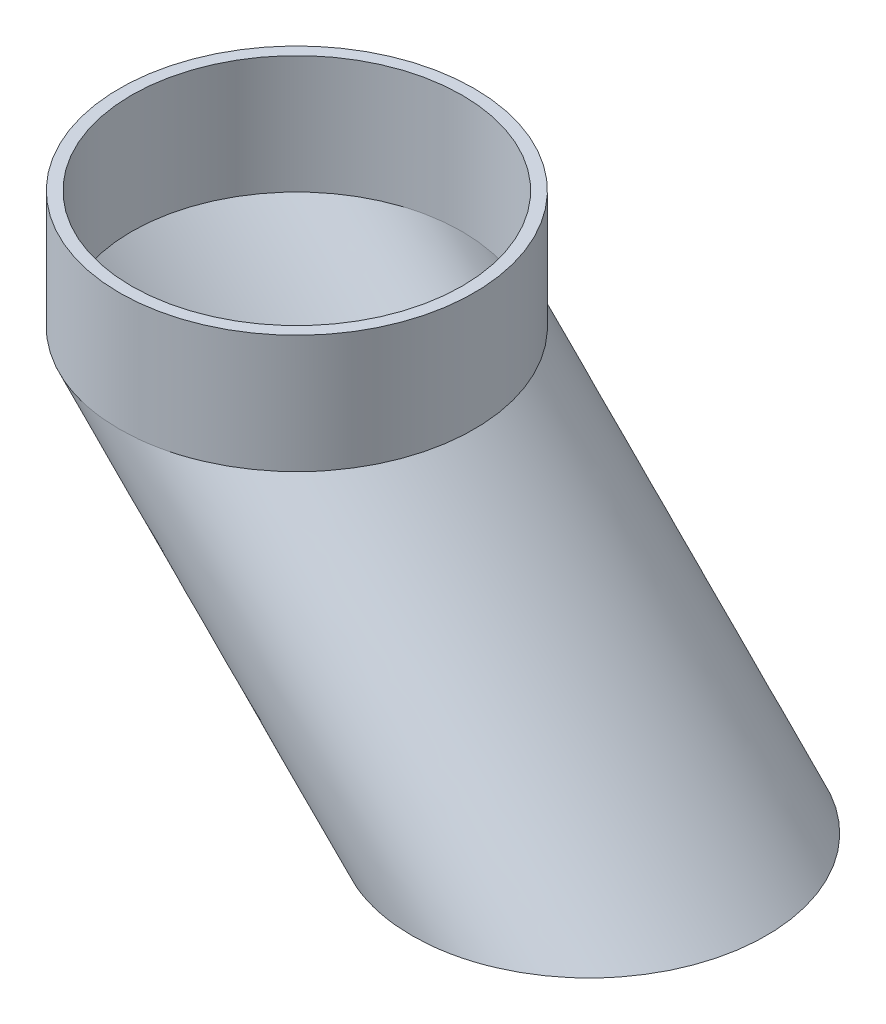
ISO-10303-21;
HEADER;
FILE_DESCRIPTION(('STEP AP214'),'2;1');
FILE_NAME('part.step','',(''),(''),'','','');
FILE_SCHEMA(('AUTOMOTIVE_DESIGN { 1 0 10303 214 1 1 1 1 }'));
ENDSEC;
DATA;
#1=APPLICATION_CONTEXT('core data for automotive mechanical design processes');
#2=APPLICATION_PROTOCOL_DEFINITION('international standard','automotive_design',2000,#1);
#3=PRODUCT_CONTEXT('',#1,'mechanical');
#4=PRODUCT('Part','Part','',(#3));
#5=PRODUCT_RELATED_PRODUCT_CATEGORY('part','',(#4));
#6=PRODUCT_DEFINITION_FORMATION('','',#4);
#7=PRODUCT_DEFINITION_CONTEXT('part definition',#1,'design');
#8=PRODUCT_DEFINITION('design','',#6,#7);
#9=PRODUCT_DEFINITION_SHAPE('','',#8);
#10=(LENGTH_UNIT() NAMED_UNIT(*) SI_UNIT(.MILLI.,.METRE.));
#11=(NAMED_UNIT(*) PLANE_ANGLE_UNIT() SI_UNIT($,.RADIAN.));
#12=(NAMED_UNIT(*) SI_UNIT($,.STERADIAN.) SOLID_ANGLE_UNIT());
#13=UNCERTAINTY_MEASURE_WITH_UNIT(LENGTH_MEASURE(1.E-05),#10,'distance_accuracy_value','');
#14=(GEOMETRIC_REPRESENTATION_CONTEXT(3) GLOBAL_UNCERTAINTY_ASSIGNED_CONTEXT((#13)) GLOBAL_UNIT_ASSIGNED_CONTEXT((#10,
#11,#12)) REPRESENTATION_CONTEXT('',''));
#15=CARTESIAN_POINT('',(0.,0.,0.));
#16=DIRECTION('',(0.,0.,1.));
#17=DIRECTION('',(1.,0.,0.));
#18=AXIS2_PLACEMENT_3D('',#15,#16,#17);
#19=CARTESIAN_POINT('',(0.,10.,0.));
#20=DIRECTION('',(0.,1.,0.));
#21=DIRECTION('',(0.,0.,1.));
#22=AXIS2_PLACEMENT_3D('',#19,#20,#21);
#23=PLANE('',#22);
#24=CARTESIAN_POINT('',(0.,10.,0.));
#25=DIRECTION('',(0.,1.,0.));
#26=DIRECTION('',(0.,0.,1.));
#27=AXIS2_PLACEMENT_3D('',#24,#25,#26);
#28=CIRCLE('',#27,15.);
#29=CARTESIAN_POINT('',(0.,10.,15.));
#30=VERTEX_POINT('',#29);
#31=EDGE_CURVE('E11',#30,#30,#28,.T.);
#32=ORIENTED_EDGE('',*,*,#31,.T.);
#33=EDGE_LOOP('',(#32));
#34=FACE_BOUND('',#33,.T.);
#35=CARTESIAN_POINT('',(0.,10.,0.));
#36=DIRECTION('',(0.,1.,0.));
#37=DIRECTION('',(1.,0.,0.));
#38=AXIS2_PLACEMENT_3D('',#35,#36,#37);
#39=CIRCLE('',#38,14.);
#40=CARTESIAN_POINT('',(14.,10.,0.));
#41=VERTEX_POINT('',#40);
#42=EDGE_CURVE('E49',#41,#41,#39,.T.);
#43=ORIENTED_EDGE('',*,*,#42,.F.);
#44=EDGE_LOOP('',(#43));
#45=FACE_BOUND('',#44,.T.);
#46=ADVANCED_FACE('F41',(#34,#45),#23,.T.);
#47=CARTESIAN_POINT('',(0.,10.,0.));
#48=DIRECTION('',(0.,-1.,0.));
#49=DIRECTION('',(0.,0.,-1.));
#50=AXIS2_PLACEMENT_3D('',#47,#48,#49);
#51=CYLINDRICAL_SURFACE('',#50,15.);
#52=ORIENTED_EDGE('',*,*,#31,.F.);
#53=EDGE_LOOP('',(#52));
#54=FACE_BOUND('',#53,.T.);
#55=CARTESIAN_POINT('',(0.,0.,0.));
#56=DIRECTION('',(0.,-1.,0.));
#57=DIRECTION('',(0.,0.,-1.));
#58=AXIS2_PLACEMENT_3D('',#55,#56,#57);
#59=CIRCLE('',#58,15.);
#60=CARTESIAN_POINT('',(0.,0.,-15.));
#61=VERTEX_POINT('',#60);
#62=EDGE_CURVE('E62',#61,#61,#59,.T.);
#63=ORIENTED_EDGE('',*,*,#62,.F.);
#64=EDGE_LOOP('',(#63));
#65=FACE_BOUND('',#64,.T.);
#66=ADVANCED_FACE('F43',(#54,#65),#51,.T.);
#67=CARTESIAN_POINT('',(0.,10.,0.));
#68=DIRECTION('',(0.,-1.,0.));
#69=DIRECTION('',(0.,0.,-1.));
#70=AXIS2_PLACEMENT_3D('',#67,#68,#69);
#71=CYLINDRICAL_SURFACE('',#70,14.);
#72=ORIENTED_EDGE('',*,*,#42,.T.);
#73=EDGE_LOOP('',(#72));
#74=FACE_BOUND('',#73,.T.);
#75=CARTESIAN_POINT('',(0.,0.,0.));
#76=DIRECTION('',(0.,1.,0.));
#77=DIRECTION('',(1.,0.,0.));
#78=AXIS2_PLACEMENT_3D('',#75,#76,#77);
#79=CIRCLE('',#78,14.);
#80=CARTESIAN_POINT('',(0.,0.,-14.));
#81=VERTEX_POINT('',#80);
#82=EDGE_CURVE('E54',#81,#81,#79,.T.);
#83=ORIENTED_EDGE('',*,*,#82,.F.);
#84=EDGE_LOOP('',(#83));
#85=FACE_BOUND('',#84,.T.);
#86=ADVANCED_FACE('F81',(#74,#85),#71,.F.);
#87=CARTESIAN_POINT('',(0.,0.,-15.));
#88=CARTESIAN_POINT('',(24.7487373415292,-24.7487373415291,-15.));
#89=CARTESIAN_POINT('',(30.,0.,-15.));
#90=CARTESIAN_POINT('',(54.7487373415292,-24.7487373415291,-15.));
#91=CARTESIAN_POINT('',(30.,0.,15.));
#92=CARTESIAN_POINT('',(54.7487373415292,-24.7487373415291,15.));
#93=CARTESIAN_POINT('',(0.,0.,15.));
#94=CARTESIAN_POINT('',(24.7487373415292,-24.7487373415291,15.));
#95=CARTESIAN_POINT('',(-30.,0.,15.));
#96=CARTESIAN_POINT('',(-5.25126265847078,-24.7487373415291,15.));
#97=CARTESIAN_POINT('',(-30.,0.,-15.));
#98=CARTESIAN_POINT('',(-5.25126265847078,-24.7487373415291,-15.));
#99=CARTESIAN_POINT('',(0.,0.,-15.));
#100=CARTESIAN_POINT('',(24.7487373415292,-24.7487373415291,-15.));
#101=(BOUNDED_SURFACE() B_SPLINE_SURFACE(3,1,((#87,#88),(#89,#90),(#91,#92),(#93,#94),(#95,#96),
(#97,#98),(#99,#100)),.UNSPECIFIED.,.T.,.F.,.F.) B_SPLINE_SURFACE_WITH_KNOTS((4,3,4),(2,2),(0.,
0.5,1.),(0.,1.),.UNSPECIFIED.) GEOMETRIC_REPRESENTATION_ITEM() RATIONAL_B_SPLINE_SURFACE(((1.,
1.),(0.333333333333333,0.333333333333333),(0.333333333333333,0.333333333333333),(1.,1.),
(0.333333333333333,0.333333333333333),(0.333333333333333,0.333333333333333),(1.,1.))) REPRESENTATION_ITEM('') SURFACE());
#102=CARTESIAN_POINT('',(24.7487373415292,-24.7487373415291,0.));
#103=DIRECTION('',(0.,-1.,0.));
#104=DIRECTION('',(0.,0.,-1.));
#105=AXIS2_PLACEMENT_3D('',#102,#103,#104);
#106=CIRCLE('',#105,15.);
#107=CARTESIAN_POINT('',(24.7487373415292,-24.7487373415291,-15.));
#108=VERTEX_POINT('',#107);
#109=EDGE_CURVE('E66',#108,#108,#106,.T.);
#110=CARTESIAN_POINT('',(24.7487373415292,-24.7487373415291,-15.));
#111=CARTESIAN_POINT('',(24.4909379942216,-24.4909379942215,-15.));
#112=CARTESIAN_POINT('',(24.233138646914,-24.2331386469139,-15.));
#113=CARTESIAN_POINT('',(23.7175399522988,-23.7175399522987,-15.));
#114=CARTESIAN_POINT('',(23.4597406049912,-23.4597406049911,-15.));
#115=CARTESIAN_POINT('',(22.944141910376,-22.944141910376,-15.));
#116=CARTESIAN_POINT('',(22.6863425630684,-22.6863425630684,-15.));
#117=CARTESIAN_POINT('',(22.1707438684533,-22.1707438684532,-15.));
#118=CARTESIAN_POINT('',(21.9129445211457,-21.9129445211456,-15.));
#119=CARTESIAN_POINT('',(21.3973458265305,-21.3973458265304,-15.));
#120=CARTESIAN_POINT('',(21.1395464792229,-21.1395464792228,-15.));
#121=CARTESIAN_POINT('',(20.6239477846077,-20.6239477846076,-15.));
#122=CARTESIAN_POINT('',(20.3661484373001,-20.3661484373,-15.));
#123=CARTESIAN_POINT('',(19.8505497426849,-19.8505497426848,-15.));
#124=CARTESIAN_POINT('',(19.5927503953773,-19.5927503953772,-15.));
#125=CARTESIAN_POINT('',(19.0771517007621,-19.077151700762,-15.));
#126=CARTESIAN_POINT('',(18.8193523534545,-18.8193523534544,-15.));
#127=CARTESIAN_POINT('',(18.3037536588393,-18.3037536588392,-15.));
#128=CARTESIAN_POINT('',(18.0459543115317,-18.0459543115316,-15.));
#129=CARTESIAN_POINT('',(17.5303556169165,-17.5303556169165,-15.));
#130=CARTESIAN_POINT('',(17.2725562696089,-17.2725562696089,-15.));
#131=CARTESIAN_POINT('',(16.7569575749937,-16.7569575749937,-15.));
#132=CARTESIAN_POINT('',(16.4991582276861,-16.4991582276861,-15.));
#133=CARTESIAN_POINT('',(15.983559533071,-15.9835595330709,-15.));
#134=CARTESIAN_POINT('',(15.7257601857634,-15.7257601857633,-15.));
#135=CARTESIAN_POINT('',(15.2101614911482,-15.2101614911481,-15.));
#136=CARTESIAN_POINT('',(14.9523621438406,-14.9523621438405,-15.));
#137=CARTESIAN_POINT('',(14.4367634492254,-14.4367634492253,-15.));
#138=CARTESIAN_POINT('',(14.1789641019178,-14.1789641019177,-15.));
#139=CARTESIAN_POINT('',(13.6633654073026,-13.6633654073025,-15.));
#140=CARTESIAN_POINT('',(13.405566059995,-13.4055660599949,-15.));
#141=CARTESIAN_POINT('',(12.8899673653798,-12.8899673653797,-15.));
#142=CARTESIAN_POINT('',(12.6321680180722,-12.6321680180722,-15.));
#143=CARTESIAN_POINT('',(12.116569323457,-12.116569323457,-15.));
#144=CARTESIAN_POINT('',(11.8587699761494,-11.8587699761494,-15.));
#145=CARTESIAN_POINT('',(11.3431712815342,-11.3431712815342,-15.));
#146=CARTESIAN_POINT('',(11.0853719342266,-11.0853719342266,-15.));
#147=CARTESIAN_POINT('',(10.5697732396114,-10.5697732396114,-15.));
#148=CARTESIAN_POINT('',(10.3119738923038,-10.3119738923038,-15.));
#149=CARTESIAN_POINT('',(9.79637519768865,-9.79637519768861,-15.));
#150=CARTESIAN_POINT('',(9.53857585038105,-9.53857585038102,-15.));
#151=CARTESIAN_POINT('',(9.02297715576586,-9.02297715576582,-15.));
#152=CARTESIAN_POINT('',(8.76517780845827,-8.76517780845823,-15.));
#153=CARTESIAN_POINT('',(8.24957911384307,-8.24957911384304,-15.));
#154=CARTESIAN_POINT('',(7.99177976653548,-7.99177976653544,-15.));
#155=CARTESIAN_POINT('',(7.47618107192028,-7.47618107192025,-15.));
#156=CARTESIAN_POINT('',(7.21838172461269,-7.21838172461266,-15.));
#157=CARTESIAN_POINT('',(6.7027830299975,-6.70278302999747,-15.));
#158=CARTESIAN_POINT('',(6.4449836826899,-6.44498368268987,-15.));
#159=CARTESIAN_POINT('',(5.92938498807471,-5.92938498807468,-15.));
#160=CARTESIAN_POINT('',(5.67158564076711,-5.67158564076709,-15.));
#161=CARTESIAN_POINT('',(5.15598694615192,-5.1559869461519,-15.));
#162=CARTESIAN_POINT('',(4.89818759884432,-4.8981875988443,-15.));
#163=CARTESIAN_POINT('',(4.38258890422913,-4.38258890422911,-15.));
#164=CARTESIAN_POINT('',(4.12478955692154,-4.12478955692152,-15.));
#165=CARTESIAN_POINT('',(3.60919086230634,-3.60919086230633,-15.));
#166=CARTESIAN_POINT('',(3.35139151499875,-3.35139151499873,-15.));
#167=CARTESIAN_POINT('',(2.83579282038356,-2.83579282038354,-15.));
#168=CARTESIAN_POINT('',(2.57799347307596,-2.57799347307595,-15.));
#169=CARTESIAN_POINT('',(2.06239477846077,-2.06239477846076,-15.));
#170=CARTESIAN_POINT('',(1.80459543115317,-1.80459543115316,-15.));
#171=CARTESIAN_POINT('',(1.28899673653798,-1.28899673653797,-15.));
#172=CARTESIAN_POINT('',(1.03119738923038,-1.03119738923038,-15.));
#173=CARTESIAN_POINT('',(0.515598694615192,-0.51559869461519,-15.));
#174=CARTESIAN_POINT('',(0.257799347307596,-0.257799347307595,-15.));
#175=CARTESIAN_POINT('',(0.,0.,-15.));
#176=B_SPLINE_CURVE_WITH_KNOTS('',3,(#110,#111,#112,#113,#114,#115,#116,#117,#118,#119,#120,
#121,#122,#123,#124,#125,#126,#127,#128,#129,#130,#131,#132,#133,#134,#135,#136,#137,#138,#139,
#140,#141,#142,#143,#144,#145,#146,#147,#148,#149,#150,#151,#152,#153,#154,#155,#156,#157,#158,
#159,#160,#161,#162,#163,#164,#165,#166,#167,#168,#169,#170,#171,#172,#173,#174,#175),
.UNSPECIFIED.,.F.,.F.,(4,2,2,2,2,2,2,2,2,2,2,2,2,2,2,2,2,2,2,2,2,2,2,2,2,2,2,2,2,2,2,2,4),(0.,
1.09375,2.1875,3.28125,4.375,5.46875,6.5625,7.65625,8.75,9.84375,10.9375,12.03125,13.125,
14.21875,15.3125,16.40625,17.5,18.59375,19.6875,20.78125,21.875,22.96875,24.0625,25.15625,26.25,
27.34375,28.4375,29.53125,30.625,31.71875,32.8125,33.90625,35.),.UNSPECIFIED.);
#177=EDGE_CURVE('BSEAM85',#108,#61,#176,.T.);
#178=ORIENTED_EDGE('',*,*,#109,.F.);
#179=ORIENTED_EDGE('',*,*,#62,.T.);
#180=ORIENTED_EDGE('',*,*,#177,.T.);
#181=ORIENTED_EDGE('',*,*,#177,.F.);
#182=EDGE_LOOP('',(#178,#180,#179,#181));
#183=FACE_BOUND('',#182,.T.);
#184=ADVANCED_FACE('F85',(#183),#101,.T.);
#185=CARTESIAN_POINT('',(24.7487373415292,-24.7487373415291,0.));
#186=DIRECTION('',(0.,-1.,0.));
#187=DIRECTION('',(0.,0.,-1.));
#188=AXIS2_PLACEMENT_3D('',#185,#186,#187);
#189=PLANE('',#188);
#190=CARTESIAN_POINT('',(24.7487373415292,-24.7487373415291,0.));
#191=DIRECTION('',(0.,-1.,0.));
#192=DIRECTION('',(0.,0.,-1.));
#193=AXIS2_PLACEMENT_3D('',#190,#191,#192);
#194=CIRCLE('',#193,14.);
#195=CARTESIAN_POINT('',(24.7487373415292,-24.7487373415291,-14.));
#196=VERTEX_POINT('',#195);
#197=EDGE_CURVE('E60',#196,#196,#194,.F.);
#198=ORIENTED_EDGE('',*,*,#197,.T.);
#199=EDGE_LOOP('',(#198));
#200=FACE_BOUND('',#199,.T.);
#201=ORIENTED_EDGE('',*,*,#109,.T.);
#202=EDGE_LOOP('',(#201));
#203=FACE_BOUND('',#202,.T.);
#204=ADVANCED_FACE('F74',(#200,#203),#189,.T.);
#205=CARTESIAN_POINT('',(0.,0.,-14.));
#206=CARTESIAN_POINT('',(24.7487373415292,-24.7487373415291,-14.));
#207=CARTESIAN_POINT('',(-28.,0.,-14.));
#208=CARTESIAN_POINT('',(-3.25126265847078,-24.7487373415291,-14.));
#209=CARTESIAN_POINT('',(-28.,0.,14.));
#210=CARTESIAN_POINT('',(-3.25126265847078,-24.7487373415291,14.));
#211=CARTESIAN_POINT('',(0.,0.,14.));
#212=CARTESIAN_POINT('',(24.7487373415292,-24.7487373415291,14.));
#213=CARTESIAN_POINT('',(28.,0.,14.));
#214=CARTESIAN_POINT('',(52.7487373415292,-24.7487373415291,14.));
#215=CARTESIAN_POINT('',(28.,0.,-14.));
#216=CARTESIAN_POINT('',(52.7487373415292,-24.7487373415291,-14.));
#217=CARTESIAN_POINT('',(0.,0.,-14.));
#218=CARTESIAN_POINT('',(24.7487373415292,-24.7487373415291,-14.));
#219=(BOUNDED_SURFACE() B_SPLINE_SURFACE(3,1,((#205,#206),(#207,#208),(#209,#210),(#211,#212),
(#213,#214),(#215,#216),(#217,#218)),.UNSPECIFIED.,.T.,.F.,.F.) B_SPLINE_SURFACE_WITH_KNOTS((4,
3,4),(2,2),(0.,0.5,1.),(0.,1.),
.UNSPECIFIED.) GEOMETRIC_REPRESENTATION_ITEM() RATIONAL_B_SPLINE_SURFACE(((1.,1.),
(0.333333333333333,0.333333333333333),(0.333333333333333,0.333333333333333),(1.,1.),
(0.333333333333333,0.333333333333333),(0.333333333333333,0.333333333333333),(1.,1.))) REPRESENTATION_ITEM('') SURFACE());
#220=CARTESIAN_POINT('',(24.7487373415292,-24.7487373415291,-14.));
#221=CARTESIAN_POINT('',(24.4909379942216,-24.4909379942215,-14.));
#222=CARTESIAN_POINT('',(24.233138646914,-24.2331386469139,-14.));
#223=CARTESIAN_POINT('',(23.7175399522988,-23.7175399522987,-14.));
#224=CARTESIAN_POINT('',(23.4597406049912,-23.4597406049911,-14.));
#225=CARTESIAN_POINT('',(22.944141910376,-22.944141910376,-14.));
#226=CARTESIAN_POINT('',(22.6863425630684,-22.6863425630684,-14.));
#227=CARTESIAN_POINT('',(22.1707438684533,-22.1707438684532,-14.));
#228=CARTESIAN_POINT('',(21.9129445211457,-21.9129445211456,-14.));
#229=CARTESIAN_POINT('',(21.3973458265305,-21.3973458265304,-14.));
#230=CARTESIAN_POINT('',(21.1395464792229,-21.1395464792228,-14.));
#231=CARTESIAN_POINT('',(20.6239477846077,-20.6239477846076,-14.));
#232=CARTESIAN_POINT('',(20.3661484373001,-20.3661484373,-14.));
#233=CARTESIAN_POINT('',(19.8505497426849,-19.8505497426848,-14.));
#234=CARTESIAN_POINT('',(19.5927503953773,-19.5927503953772,-14.));
#235=CARTESIAN_POINT('',(19.0771517007621,-19.077151700762,-14.));
#236=CARTESIAN_POINT('',(18.8193523534545,-18.8193523534544,-14.));
#237=CARTESIAN_POINT('',(18.3037536588393,-18.3037536588392,-14.));
#238=CARTESIAN_POINT('',(18.0459543115317,-18.0459543115316,-14.));
#239=CARTESIAN_POINT('',(17.5303556169165,-17.5303556169165,-14.));
#240=CARTESIAN_POINT('',(17.2725562696089,-17.2725562696089,-14.));
#241=CARTESIAN_POINT('',(16.7569575749937,-16.7569575749937,-14.));
#242=CARTESIAN_POINT('',(16.4991582276861,-16.4991582276861,-14.));
#243=CARTESIAN_POINT('',(15.983559533071,-15.9835595330709,-14.));
#244=CARTESIAN_POINT('',(15.7257601857634,-15.7257601857633,-14.));
#245=CARTESIAN_POINT('',(15.2101614911482,-15.2101614911481,-14.));
#246=CARTESIAN_POINT('',(14.9523621438406,-14.9523621438405,-14.));
#247=CARTESIAN_POINT('',(14.4367634492254,-14.4367634492253,-14.));
#248=CARTESIAN_POINT('',(14.1789641019178,-14.1789641019177,-14.));
#249=CARTESIAN_POINT('',(13.6633654073026,-13.6633654073025,-14.));
#250=CARTESIAN_POINT('',(13.405566059995,-13.4055660599949,-14.));
#251=CARTESIAN_POINT('',(12.8899673653798,-12.8899673653797,-14.));
#252=CARTESIAN_POINT('',(12.6321680180722,-12.6321680180722,-14.));
#253=CARTESIAN_POINT('',(12.116569323457,-12.116569323457,-14.));
#254=CARTESIAN_POINT('',(11.8587699761494,-11.8587699761494,-14.));
#255=CARTESIAN_POINT('',(11.3431712815342,-11.3431712815342,-14.));
#256=CARTESIAN_POINT('',(11.0853719342266,-11.0853719342266,-14.));
#257=CARTESIAN_POINT('',(10.5697732396114,-10.5697732396114,-14.));
#258=CARTESIAN_POINT('',(10.3119738923038,-10.3119738923038,-14.));
#259=CARTESIAN_POINT('',(9.79637519768865,-9.79637519768861,-14.));
#260=CARTESIAN_POINT('',(9.53857585038105,-9.53857585038102,-14.));
#261=CARTESIAN_POINT('',(9.02297715576586,-9.02297715576582,-14.));
#262=CARTESIAN_POINT('',(8.76517780845827,-8.76517780845823,-14.));
#263=CARTESIAN_POINT('',(8.24957911384307,-8.24957911384304,-14.));
#264=CARTESIAN_POINT('',(7.99177976653548,-7.99177976653544,-14.));
#265=CARTESIAN_POINT('',(7.47618107192028,-7.47618107192025,-14.));
#266=CARTESIAN_POINT('',(7.21838172461269,-7.21838172461266,-14.));
#267=CARTESIAN_POINT('',(6.7027830299975,-6.70278302999747,-14.));
#268=CARTESIAN_POINT('',(6.4449836826899,-6.44498368268987,-14.));
#269=CARTESIAN_POINT('',(5.92938498807471,-5.92938498807468,-14.));
#270=CARTESIAN_POINT('',(5.67158564076711,-5.67158564076709,-14.));
#271=CARTESIAN_POINT('',(5.15598694615192,-5.1559869461519,-14.));
#272=CARTESIAN_POINT('',(4.89818759884432,-4.8981875988443,-14.));
#273=CARTESIAN_POINT('',(4.38258890422913,-4.38258890422911,-14.));
#274=CARTESIAN_POINT('',(4.12478955692154,-4.12478955692152,-14.));
#275=CARTESIAN_POINT('',(3.60919086230634,-3.60919086230633,-14.));
#276=CARTESIAN_POINT('',(3.35139151499875,-3.35139151499873,-14.));
#277=CARTESIAN_POINT('',(2.83579282038356,-2.83579282038354,-14.));
#278=CARTESIAN_POINT('',(2.57799347307596,-2.57799347307595,-14.));
#279=CARTESIAN_POINT('',(2.06239477846077,-2.06239477846076,-14.));
#280=CARTESIAN_POINT('',(1.80459543115317,-1.80459543115316,-14.));
#281=CARTESIAN_POINT('',(1.28899673653798,-1.28899673653797,-14.));
#282=CARTESIAN_POINT('',(1.03119738923038,-1.03119738923038,-14.));
#283=CARTESIAN_POINT('',(0.515598694615192,-0.51559869461519,-14.));
#284=CARTESIAN_POINT('',(0.257799347307596,-0.257799347307595,-14.));
#285=CARTESIAN_POINT('',(0.,0.,-14.));
#286=B_SPLINE_CURVE_WITH_KNOTS('',3,(#220,#221,#222,#223,#224,#225,#226,#227,#228,#229,#230,
#231,#232,#233,#234,#235,#236,#237,#238,#239,#240,#241,#242,#243,#244,#245,#246,#247,#248,#249,
#250,#251,#252,#253,#254,#255,#256,#257,#258,#259,#260,#261,#262,#263,#264,#265,#266,#267,#268,
#269,#270,#271,#272,#273,#274,#275,#276,#277,#278,#279,#280,#281,#282,#283,#284,#285),
.UNSPECIFIED.,.F.,.F.,(4,2,2,2,2,2,2,2,2,2,2,2,2,2,2,2,2,2,2,2,2,2,2,2,2,2,2,2,2,2,2,2,4),(0.,
1.09375,2.1875,3.28125,4.375,5.46875,6.5625,7.65625,8.75,9.84375,10.9375,12.03125,13.125,
14.21875,15.3125,16.40625,17.5,18.59375,19.6875,20.78125,21.875,22.96875,24.0625,25.15625,26.25,
27.34375,28.4375,29.53125,30.625,31.71875,32.8125,33.90625,35.),.UNSPECIFIED.);
#287=EDGE_CURVE('BSEAM77',#196,#81,#286,.T.);
#288=ORIENTED_EDGE('',*,*,#197,.F.);
#289=ORIENTED_EDGE('',*,*,#82,.T.);
#290=ORIENTED_EDGE('',*,*,#287,.T.);
#291=ORIENTED_EDGE('',*,*,#287,.F.);
#292=EDGE_LOOP('',(#288,#290,#289,#291));
#293=FACE_BOUND('',#292,.T.);
#294=ADVANCED_FACE('F77',(#293),#219,.T.);
#295=CLOSED_SHELL('',(#46,#66,#86,#184,#204,#294));
#296=MANIFOLD_SOLID_BREP('B2',#295);
#297=ADVANCED_BREP_SHAPE_REPRESENTATION('',(#18,#296),#14);
#298=SHAPE_DEFINITION_REPRESENTATION(#9,#297);
ENDSEC;
END-ISO-10303-21;
